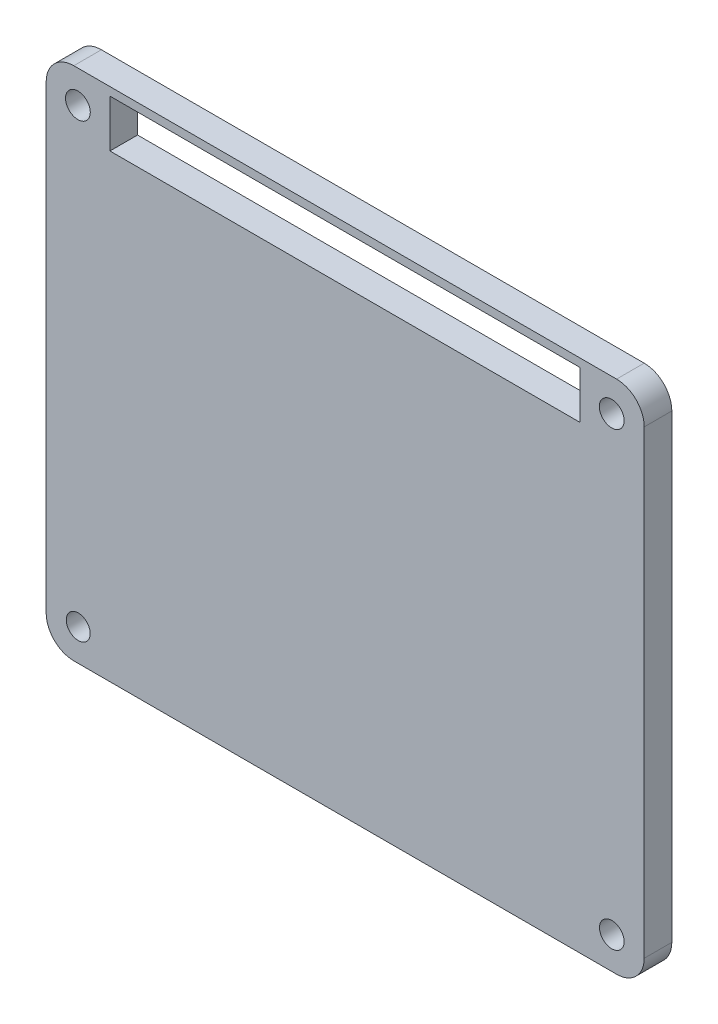
ISO-10303-21;
HEADER;
FILE_DESCRIPTION(('STEP AP214'),'2;1');
FILE_NAME('part.step','',(''),(''),'','','');
FILE_SCHEMA(('AUTOMOTIVE_DESIGN { 1 0 10303 214 1 1 1 1 }'));
ENDSEC;
DATA;
#1=APPLICATION_CONTEXT('core data for automotive mechanical design processes');
#2=APPLICATION_PROTOCOL_DEFINITION('international standard','automotive_design',2000,#1);
#3=PRODUCT_CONTEXT('',#1,'mechanical');
#4=PRODUCT('Part','Part','',(#3));
#5=PRODUCT_RELATED_PRODUCT_CATEGORY('part','',(#4));
#6=PRODUCT_DEFINITION_FORMATION('','',#4);
#7=PRODUCT_DEFINITION_CONTEXT('part definition',#1,'design');
#8=PRODUCT_DEFINITION('design','',#6,#7);
#9=PRODUCT_DEFINITION_SHAPE('','',#8);
#10=(LENGTH_UNIT() NAMED_UNIT(*) SI_UNIT(.MILLI.,.METRE.));
#11=(NAMED_UNIT(*) PLANE_ANGLE_UNIT() SI_UNIT($,.RADIAN.));
#12=(NAMED_UNIT(*) SI_UNIT($,.STERADIAN.) SOLID_ANGLE_UNIT());
#13=UNCERTAINTY_MEASURE_WITH_UNIT(LENGTH_MEASURE(1.E-05),#10,'distance_accuracy_value','');
#14=(GEOMETRIC_REPRESENTATION_CONTEXT(3) GLOBAL_UNCERTAINTY_ASSIGNED_CONTEXT((#13)) GLOBAL_UNIT_ASSIGNED_CONTEXT((#10,
#11,#12)) REPRESENTATION_CONTEXT('',''));
#15=CARTESIAN_POINT('',(0.,0.,0.));
#16=DIRECTION('',(0.,0.,1.));
#17=DIRECTION('',(1.,0.,0.));
#18=AXIS2_PLACEMENT_3D('',#15,#16,#17);
#19=CARTESIAN_POINT('',(201.871913251507,253.348131253436,3.));
#20=DIRECTION('',(0.,0.,-1.));
#21=DIRECTION('',(-1.,0.,0.));
#22=AXIS2_PLACEMENT_3D('',#19,#20,#21);
#23=PLANE('',#22);
#24=CARTESIAN_POINT('',(201.871913251507,253.348131253436,3.));
#25=DIRECTION('',(0.,0.,1.));
#26=DIRECTION('',(-1.,0.,0.));
#27=AXIS2_PLACEMENT_3D('',#24,#25,#26);
#28=CIRCLE('',#27,3.);
#29=CARTESIAN_POINT('',(201.871913251507,250.348131253436,3.));
#30=VERTEX_POINT('',#29);
#31=CARTESIAN_POINT('',(204.871913251507,253.348131253436,3.));
#32=VERTEX_POINT('',#31);
#33=EDGE_CURVE('E180',#30,#32,#28,.T.);
#34=ORIENTED_EDGE('',*,*,#33,.T.);
#35=DIRECTION('',(0.,1.,0.));
#36=VECTOR('',#35,1.);
#37=CARTESIAN_POINT('',(204.871913251507,303.333520822125,3.));
#38=LINE('',#37,#36);
#39=CARTESIAN_POINT('',(204.871913251507,303.333520822125,3.));
#40=VERTEX_POINT('',#39);
#41=EDGE_CURVE('E184',#32,#40,#38,.T.);
#42=ORIENTED_EDGE('',*,*,#41,.T.);
#43=CARTESIAN_POINT('',(201.871913251507,303.333520822125,3.));
#44=DIRECTION('',(0.,0.,1.));
#45=DIRECTION('',(-1.,0.,0.));
#46=AXIS2_PLACEMENT_3D('',#43,#44,#45);
#47=CIRCLE('',#46,3.);
#48=CARTESIAN_POINT('',(201.871913251507,306.333520822125,3.));
#49=VERTEX_POINT('',#48);
#50=EDGE_CURVE('E188',#40,#49,#47,.T.);
#51=ORIENTED_EDGE('',*,*,#50,.T.);
#52=DIRECTION('',(-1.,0.,0.));
#53=VECTOR('',#52,1.);
#54=CARTESIAN_POINT('',(142.914343154071,306.333520822125,3.));
#55=LINE('',#54,#53);
#56=CARTESIAN_POINT('',(142.914343154071,306.333520822125,3.));
#57=VERTEX_POINT('',#56);
#58=EDGE_CURVE('E191',#49,#57,#55,.T.);
#59=ORIENTED_EDGE('',*,*,#58,.T.);
#60=CARTESIAN_POINT('',(142.914343154071,303.333520822125,3.));
#61=DIRECTION('',(0.,0.,1.));
#62=DIRECTION('',(1.,0.,0.));
#63=AXIS2_PLACEMENT_3D('',#60,#61,#62);
#64=CIRCLE('',#63,3.);
#65=CARTESIAN_POINT('',(139.914343154071,303.333520822125,3.));
#66=VERTEX_POINT('',#65);
#67=EDGE_CURVE('E194',#57,#66,#64,.T.);
#68=ORIENTED_EDGE('',*,*,#67,.T.);
#69=DIRECTION('',(0.,-1.,0.));
#70=VECTOR('',#69,1.);
#71=CARTESIAN_POINT('',(139.914343154071,253.348131253436,3.));
#72=LINE('',#71,#70);
#73=CARTESIAN_POINT('',(139.914343154071,253.348131253436,3.));
#74=VERTEX_POINT('',#73);
#75=EDGE_CURVE('E197',#66,#74,#72,.T.);
#76=ORIENTED_EDGE('',*,*,#75,.T.);
#77=CARTESIAN_POINT('',(142.914343154071,253.348131253436,3.));
#78=DIRECTION('',(0.,0.,1.));
#79=DIRECTION('',(-1.,0.,0.));
#80=AXIS2_PLACEMENT_3D('',#77,#78,#79);
#81=CIRCLE('',#80,3.);
#82=CARTESIAN_POINT('',(142.914343154071,250.348131253436,3.));
#83=VERTEX_POINT('',#82);
#84=EDGE_CURVE('E200',#74,#83,#81,.T.);
#85=ORIENTED_EDGE('',*,*,#84,.T.);
#86=DIRECTION('',(1.,0.,0.));
#87=VECTOR('',#86,1.);
#88=CARTESIAN_POINT('',(201.871913251507,250.348131253436,3.));
#89=LINE('',#88,#87);
#90=EDGE_CURVE('E203',#83,#30,#89,.T.);
#91=ORIENTED_EDGE('',*,*,#90,.T.);
#92=EDGE_LOOP('',(#34,#42,#51,#59,#68,#76,#85,#91));
#93=FACE_BOUND('',#92,.T.);
#94=DIRECTION('',(0.,-1.,0.));
#95=VECTOR('',#94,1.);
#96=CARTESIAN_POINT('',(146.841273749476,305.438109267828,3.));
#97=LINE('',#96,#95);
#98=CARTESIAN_POINT('',(146.841273749476,305.438109267828,3.));
#99=VERTEX_POINT('',#98);
#100=CARTESIAN_POINT('',(146.841273749476,300.27526589932,3.));
#101=VERTEX_POINT('',#100);
#102=EDGE_CURVE('E129',#99,#101,#97,.T.);
#103=ORIENTED_EDGE('',*,*,#102,.F.);
#104=DIRECTION('',(-1.,0.,0.));
#105=VECTOR('',#104,1.);
#106=CARTESIAN_POINT('',(146.841273749476,305.438109267828,3.));
#107=LINE('',#106,#105);
#108=CARTESIAN_POINT('',(197.901828008849,305.438109267828,3.));
#109=VERTEX_POINT('',#108);
#110=EDGE_CURVE('E156',#109,#99,#107,.T.);
#111=ORIENTED_EDGE('',*,*,#110,.F.);
#112=DIRECTION('',(0.,1.,0.));
#113=VECTOR('',#112,1.);
#114=CARTESIAN_POINT('',(197.901828008849,305.438109267828,3.));
#115=LINE('',#114,#113);
#116=CARTESIAN_POINT('',(197.901828008849,300.27526589932,3.));
#117=VERTEX_POINT('',#116);
#118=EDGE_CURVE('E152',#117,#109,#115,.T.);
#119=ORIENTED_EDGE('',*,*,#118,.F.);
#120=DIRECTION('',(1.,0.,0.));
#121=VECTOR('',#120,1.);
#122=CARTESIAN_POINT('',(146.841273749476,300.27526589932,3.));
#123=LINE('',#122,#121);
#124=EDGE_CURVE('E138',#101,#117,#123,.T.);
#125=ORIENTED_EDGE('',*,*,#124,.F.);
#126=EDGE_LOOP('',(#103,#111,#119,#125));
#127=FACE_BOUND('',#126,.T.);
#128=CARTESIAN_POINT('',(143.360544481449,302.831604494432,3.));
#129=DIRECTION('',(0.,0.,1.));
#130=DIRECTION('',(1.,0.,0.));
#131=AXIS2_PLACEMENT_3D('',#128,#129,#130);
#132=CIRCLE('',#131,1.34534522063001);
#133=CARTESIAN_POINT('',(144.705889702079,302.831604494432,3.));
#134=VERTEX_POINT('',#133);
#135=EDGE_CURVE('E164',#134,#134,#132,.T.);
#136=ORIENTED_EDGE('',*,*,#135,.F.);
#137=EDGE_LOOP('',(#136));
#138=FACE_BOUND('',#137,.T.);
#139=CARTESIAN_POINT('',(201.344684378207,302.818633302361,3.));
#140=DIRECTION('',(0.,0.,1.));
#141=DIRECTION('',(1.,0.,0.));
#142=AXIS2_PLACEMENT_3D('',#139,#140,#141);
#143=CIRCLE('',#142,1.34690922053071);
#144=CARTESIAN_POINT('',(202.691593598737,302.818633302361,3.));
#145=VERTEX_POINT('',#144);
#146=EDGE_CURVE('E369',#145,#145,#143,.T.);
#147=ORIENTED_EDGE('',*,*,#146,.F.);
#148=EDGE_LOOP('',(#147));
#149=FACE_BOUND('',#148,.T.);
#150=CARTESIAN_POINT('',(143.395469298573,253.802031827382,3.));
#151=DIRECTION('',(0.,0.,1.));
#152=DIRECTION('',(1.,0.,0.));
#153=AXIS2_PLACEMENT_3D('',#150,#151,#152);
#154=CIRCLE('',#153,1.29861131616477);
#155=CARTESIAN_POINT('',(144.694080614738,253.802031827382,3.));
#156=VERTEX_POINT('',#155);
#157=EDGE_CURVE('E361',#156,#156,#154,.T.);
#158=ORIENTED_EDGE('',*,*,#157,.F.);
#159=EDGE_LOOP('',(#158));
#160=FACE_BOUND('',#159,.T.);
#161=CARTESIAN_POINT('',(201.354862045578,253.815125267861,3.));
#162=DIRECTION('',(0.,0.,1.));
#163=DIRECTION('',(1.,0.,0.));
#164=AXIS2_PLACEMENT_3D('',#161,#162,#163);
#165=CIRCLE('',#164,1.3356837614244);
#166=CARTESIAN_POINT('',(202.690545807002,253.815125267861,3.));
#167=VERTEX_POINT('',#166);
#168=EDGE_CURVE('E350',#167,#167,#165,.T.);
#169=ORIENTED_EDGE('',*,*,#168,.F.);
#170=EDGE_LOOP('',(#169));
#171=FACE_BOUND('',#170,.T.);
#172=ADVANCED_FACE('F39',(#93,#127,#138,#149,#160,#171),#23,.F.);
#173=CARTESIAN_POINT('',(201.871913251507,253.348131253436,0.));
#174=DIRECTION('',(0.,0.,-1.));
#175=DIRECTION('',(-1.,0.,0.));
#176=AXIS2_PLACEMENT_3D('',#173,#174,#175);
#177=PLANE('',#176);
#178=CARTESIAN_POINT('',(143.395469298573,253.802031827382,0.));
#179=DIRECTION('',(0.,0.,1.));
#180=DIRECTION('',(1.,0.,0.));
#181=AXIS2_PLACEMENT_3D('',#178,#179,#180);
#182=CIRCLE('',#181,1.29861131616477);
#183=CARTESIAN_POINT('',(144.694080614738,253.802031827382,0.));
#184=VERTEX_POINT('',#183);
#185=EDGE_CURVE('E358',#184,#184,#182,.T.);
#186=ORIENTED_EDGE('',*,*,#185,.T.);
#187=EDGE_LOOP('',(#186));
#188=FACE_BOUND('',#187,.T.);
#189=CARTESIAN_POINT('',(143.360544481449,302.831604494432,0.));
#190=DIRECTION('',(0.,0.,1.));
#191=DIRECTION('',(1.,0.,0.));
#192=AXIS2_PLACEMENT_3D('',#189,#190,#191);
#193=CIRCLE('',#192,1.34534522063001);
#194=CARTESIAN_POINT('',(144.705889702079,302.831604494432,0.));
#195=VERTEX_POINT('',#194);
#196=EDGE_CURVE('E373',#195,#195,#193,.T.);
#197=ORIENTED_EDGE('',*,*,#196,.T.);
#198=EDGE_LOOP('',(#197));
#199=FACE_BOUND('',#198,.T.);
#200=CARTESIAN_POINT('',(201.871913251507,253.348131253436,0.));
#201=DIRECTION('',(0.,0.,1.));
#202=DIRECTION('',(-1.,0.,0.));
#203=AXIS2_PLACEMENT_3D('',#200,#201,#202);
#204=CIRCLE('',#203,3.);
#205=CARTESIAN_POINT('',(201.871913251507,250.348131253436,0.));
#206=VERTEX_POINT('',#205);
#207=CARTESIAN_POINT('',(204.871913251507,253.348131253436,0.));
#208=VERTEX_POINT('',#207);
#209=EDGE_CURVE('E147',#206,#208,#204,.T.);
#210=ORIENTED_EDGE('',*,*,#209,.F.);
#211=DIRECTION('',(1.,0.,0.));
#212=VECTOR('',#211,1.);
#213=CARTESIAN_POINT('',(201.871913251507,250.348131253436,0.));
#214=LINE('',#213,#212);
#215=CARTESIAN_POINT('',(142.914343154071,250.348131253436,0.));
#216=VERTEX_POINT('',#215);
#217=EDGE_CURVE('E185',#216,#206,#214,.T.);
#218=ORIENTED_EDGE('',*,*,#217,.F.);
#219=CARTESIAN_POINT('',(142.914343154071,253.348131253436,0.));
#220=DIRECTION('',(0.,0.,1.));
#221=DIRECTION('',(-1.,0.,0.));
#222=AXIS2_PLACEMENT_3D('',#219,#220,#221);
#223=CIRCLE('',#222,3.);
#224=CARTESIAN_POINT('',(139.914343154071,253.348131253436,0.));
#225=VERTEX_POINT('',#224);
#226=EDGE_CURVE('E225',#225,#216,#223,.T.);
#227=ORIENTED_EDGE('',*,*,#226,.F.);
#228=DIRECTION('',(0.,-1.,0.));
#229=VECTOR('',#228,1.);
#230=CARTESIAN_POINT('',(139.914343154071,253.348131253436,0.));
#231=LINE('',#230,#229);
#232=CARTESIAN_POINT('',(139.914343154071,303.333520822125,0.));
#233=VERTEX_POINT('',#232);
#234=EDGE_CURVE('E222',#233,#225,#231,.T.);
#235=ORIENTED_EDGE('',*,*,#234,.F.);
#236=CARTESIAN_POINT('',(142.914343154071,303.333520822125,0.));
#237=DIRECTION('',(0.,0.,1.));
#238=DIRECTION('',(1.,0.,0.));
#239=AXIS2_PLACEMENT_3D('',#236,#237,#238);
#240=CIRCLE('',#239,3.);
#241=CARTESIAN_POINT('',(142.914343154071,306.333520822125,0.));
#242=VERTEX_POINT('',#241);
#243=EDGE_CURVE('E219',#242,#233,#240,.T.);
#244=ORIENTED_EDGE('',*,*,#243,.F.);
#245=DIRECTION('',(-1.,0.,0.));
#246=VECTOR('',#245,1.);
#247=CARTESIAN_POINT('',(142.914343154071,306.333520822125,0.));
#248=LINE('',#247,#246);
#249=CARTESIAN_POINT('',(201.871913251507,306.333520822125,0.));
#250=VERTEX_POINT('',#249);
#251=EDGE_CURVE('E216',#250,#242,#248,.T.);
#252=ORIENTED_EDGE('',*,*,#251,.F.);
#253=CARTESIAN_POINT('',(201.871913251507,303.333520822125,0.));
#254=DIRECTION('',(0.,0.,1.));
#255=DIRECTION('',(-1.,0.,0.));
#256=AXIS2_PLACEMENT_3D('',#253,#254,#255);
#257=CIRCLE('',#256,3.);
#258=CARTESIAN_POINT('',(204.871913251507,303.333520822125,0.));
#259=VERTEX_POINT('',#258);
#260=EDGE_CURVE('E213',#259,#250,#257,.T.);
#261=ORIENTED_EDGE('',*,*,#260,.F.);
#262=DIRECTION('',(0.,1.,0.));
#263=VECTOR('',#262,1.);
#264=CARTESIAN_POINT('',(204.871913251507,303.333520822125,0.));
#265=LINE('',#264,#263);
#266=EDGE_CURVE('E210',#208,#259,#265,.T.);
#267=ORIENTED_EDGE('',*,*,#266,.F.);
#268=EDGE_LOOP('',(#210,#218,#227,#235,#244,#252,#261,#267));
#269=FACE_BOUND('',#268,.T.);
#270=DIRECTION('',(-1.,0.,0.));
#271=VECTOR('',#270,1.);
#272=CARTESIAN_POINT('',(146.841273749476,305.438109267828,0.));
#273=LINE('',#272,#271);
#274=CARTESIAN_POINT('',(197.901828008849,305.438109267828,0.));
#275=VERTEX_POINT('',#274);
#276=CARTESIAN_POINT('',(146.841273749476,305.438109267828,0.));
#277=VERTEX_POINT('',#276);
#278=EDGE_CURVE('E139',#275,#277,#273,.T.);
#279=ORIENTED_EDGE('',*,*,#278,.T.);
#280=DIRECTION('',(0.,-1.,0.));
#281=VECTOR('',#280,1.);
#282=CARTESIAN_POINT('',(146.841273749476,305.438109267828,0.));
#283=LINE('',#282,#281);
#284=CARTESIAN_POINT('',(146.841273749476,300.27526589932,0.));
#285=VERTEX_POINT('',#284);
#286=EDGE_CURVE('E63',#277,#285,#283,.T.);
#287=ORIENTED_EDGE('',*,*,#286,.T.);
#288=DIRECTION('',(1.,0.,0.));
#289=VECTOR('',#288,1.);
#290=CARTESIAN_POINT('',(146.841273749476,300.27526589932,0.));
#291=LINE('',#290,#289);
#292=CARTESIAN_POINT('',(197.901828008849,300.27526589932,0.));
#293=VERTEX_POINT('',#292);
#294=EDGE_CURVE('E145',#285,#293,#291,.T.);
#295=ORIENTED_EDGE('',*,*,#294,.T.);
#296=DIRECTION('',(0.,1.,0.));
#297=VECTOR('',#296,1.);
#298=CARTESIAN_POINT('',(197.901828008849,305.438109267828,0.));
#299=LINE('',#298,#297);
#300=EDGE_CURVE('E167',#293,#275,#299,.T.);
#301=ORIENTED_EDGE('',*,*,#300,.T.);
#302=EDGE_LOOP('',(#279,#287,#295,#301));
#303=FACE_BOUND('',#302,.T.);
#304=CARTESIAN_POINT('',(201.344684378207,302.818633302361,0.));
#305=DIRECTION('',(0.,0.,1.));
#306=DIRECTION('',(1.,0.,0.));
#307=AXIS2_PLACEMENT_3D('',#304,#305,#306);
#308=CIRCLE('',#307,1.34690922053071);
#309=CARTESIAN_POINT('',(202.691593598737,302.818633302361,0.));
#310=VERTEX_POINT('',#309);
#311=EDGE_CURVE('E365',#310,#310,#308,.T.);
#312=ORIENTED_EDGE('',*,*,#311,.T.);
#313=EDGE_LOOP('',(#312));
#314=FACE_BOUND('',#313,.T.);
#315=CARTESIAN_POINT('',(201.354862045578,253.815125267861,0.));
#316=DIRECTION('',(0.,0.,1.));
#317=DIRECTION('',(1.,0.,0.));
#318=AXIS2_PLACEMENT_3D('',#315,#316,#317);
#319=CIRCLE('',#318,1.3356837614244);
#320=CARTESIAN_POINT('',(202.690545807002,253.815125267861,0.));
#321=VERTEX_POINT('',#320);
#322=EDGE_CURVE('E353',#321,#321,#319,.T.);
#323=ORIENTED_EDGE('',*,*,#322,.T.);
#324=EDGE_LOOP('',(#323));
#325=FACE_BOUND('',#324,.T.);
#326=ADVANCED_FACE('F264',(#188,#199,#269,#303,#314,#325),#177,.T.);
#327=CARTESIAN_POINT('',(201.871913251507,253.348131253436,3.));
#328=DIRECTION('',(0.,0.,-1.));
#329=DIRECTION('',(-1.,0.,0.));
#330=AXIS2_PLACEMENT_3D('',#327,#328,#329);
#331=CYLINDRICAL_SURFACE('',#330,3.);
#332=ORIENTED_EDGE('',*,*,#209,.T.);
#333=DIRECTION('',(0.,0.,-1.));
#334=VECTOR('',#333,1.);
#335=CARTESIAN_POINT('',(204.871913251507,253.348131253436,3.));
#336=LINE('',#335,#334);
#337=EDGE_CURVE('E11',#32,#208,#336,.T.);
#338=ORIENTED_EDGE('',*,*,#337,.F.);
#339=ORIENTED_EDGE('',*,*,#33,.F.);
#340=DIRECTION('',(0.,0.,-1.));
#341=VECTOR('',#340,1.);
#342=CARTESIAN_POINT('',(201.871913251507,250.348131253436,3.));
#343=LINE('',#342,#341);
#344=EDGE_CURVE('E206',#30,#206,#343,.T.);
#345=ORIENTED_EDGE('',*,*,#344,.T.);
#346=EDGE_LOOP('',(#332,#338,#339,#345));
#347=FACE_BOUND('',#346,.T.);
#348=ADVANCED_FACE('F41',(#347),#331,.T.);
#349=CARTESIAN_POINT('',(204.871913251507,303.333520822125,3.));
#350=DIRECTION('',(-1.,0.,0.));
#351=DIRECTION('',(0.,0.,1.));
#352=AXIS2_PLACEMENT_3D('',#349,#350,#351);
#353=PLANE('',#352);
#354=ORIENTED_EDGE('',*,*,#266,.T.);
#355=DIRECTION('',(0.,0.,-1.));
#356=VECTOR('',#355,1.);
#357=CARTESIAN_POINT('',(204.871913251507,303.333520822125,3.));
#358=LINE('',#357,#356);
#359=EDGE_CURVE('E48',#40,#259,#358,.T.);
#360=ORIENTED_EDGE('',*,*,#359,.F.);
#361=ORIENTED_EDGE('',*,*,#41,.F.);
#362=ORIENTED_EDGE('',*,*,#337,.T.);
#363=EDGE_LOOP('',(#354,#360,#361,#362));
#364=FACE_BOUND('',#363,.T.);
#365=ADVANCED_FACE('F281',(#364),#353,.F.);
#366=CARTESIAN_POINT('',(201.871913251507,303.333520822125,3.));
#367=DIRECTION('',(0.,0.,-1.));
#368=DIRECTION('',(-1.,0.,0.));
#369=AXIS2_PLACEMENT_3D('',#366,#367,#368);
#370=CYLINDRICAL_SURFACE('',#369,3.);
#371=ORIENTED_EDGE('',*,*,#260,.T.);
#372=DIRECTION('',(0.,0.,-1.));
#373=VECTOR('',#372,1.);
#374=CARTESIAN_POINT('',(201.871913251507,306.333520822125,3.));
#375=LINE('',#374,#373);
#376=EDGE_CURVE('E249',#49,#250,#375,.T.);
#377=ORIENTED_EDGE('',*,*,#376,.F.);
#378=ORIENTED_EDGE('',*,*,#50,.F.);
#379=ORIENTED_EDGE('',*,*,#359,.T.);
#380=EDGE_LOOP('',(#371,#377,#378,#379));
#381=FACE_BOUND('',#380,.T.);
#382=ADVANCED_FACE('F258',(#381),#370,.T.);
#383=CARTESIAN_POINT('',(142.914343154071,306.333520822125,3.));
#384=DIRECTION('',(0.,-1.,0.));
#385=DIRECTION('',(0.,0.,-1.));
#386=AXIS2_PLACEMENT_3D('',#383,#384,#385);
#387=PLANE('',#386);
#388=ORIENTED_EDGE('',*,*,#251,.T.);
#389=DIRECTION('',(0.,0.,-1.));
#390=VECTOR('',#389,1.);
#391=CARTESIAN_POINT('',(142.914343154071,306.333520822125,3.));
#392=LINE('',#391,#390);
#393=EDGE_CURVE('E245',#57,#242,#392,.T.);
#394=ORIENTED_EDGE('',*,*,#393,.F.);
#395=ORIENTED_EDGE('',*,*,#58,.F.);
#396=ORIENTED_EDGE('',*,*,#376,.T.);
#397=EDGE_LOOP('',(#388,#394,#395,#396));
#398=FACE_BOUND('',#397,.T.);
#399=ADVANCED_FACE('F270',(#398),#387,.F.);
#400=CARTESIAN_POINT('',(142.914343154071,303.333520822125,3.));
#401=DIRECTION('',(0.,0.,-1.));
#402=DIRECTION('',(-1.,0.,0.));
#403=AXIS2_PLACEMENT_3D('',#400,#401,#402);
#404=CYLINDRICAL_SURFACE('',#403,3.);
#405=ORIENTED_EDGE('',*,*,#243,.T.);
#406=DIRECTION('',(0.,0.,-1.));
#407=VECTOR('',#406,1.);
#408=CARTESIAN_POINT('',(139.914343154071,303.333520822125,3.));
#409=LINE('',#408,#407);
#410=EDGE_CURVE('E241',#66,#233,#409,.T.);
#411=ORIENTED_EDGE('',*,*,#410,.F.);
#412=ORIENTED_EDGE('',*,*,#67,.F.);
#413=ORIENTED_EDGE('',*,*,#393,.T.);
#414=EDGE_LOOP('',(#405,#411,#412,#413));
#415=FACE_BOUND('',#414,.T.);
#416=ADVANCED_FACE('F274',(#415),#404,.T.);
#417=CARTESIAN_POINT('',(139.914343154071,253.348131253436,3.));
#418=DIRECTION('',(1.,0.,0.));
#419=DIRECTION('',(0.,0.,-1.));
#420=AXIS2_PLACEMENT_3D('',#417,#418,#419);
#421=PLANE('',#420);
#422=ORIENTED_EDGE('',*,*,#234,.T.);
#423=DIRECTION('',(0.,0.,-1.));
#424=VECTOR('',#423,1.);
#425=CARTESIAN_POINT('',(139.914343154071,253.348131253436,3.));
#426=LINE('',#425,#424);
#427=EDGE_CURVE('E237',#74,#225,#426,.T.);
#428=ORIENTED_EDGE('',*,*,#427,.F.);
#429=ORIENTED_EDGE('',*,*,#75,.F.);
#430=ORIENTED_EDGE('',*,*,#410,.T.);
#431=EDGE_LOOP('',(#422,#428,#429,#430));
#432=FACE_BOUND('',#431,.T.);
#433=ADVANCED_FACE('F294',(#432),#421,.F.);
#434=CARTESIAN_POINT('',(142.914343154071,253.348131253436,3.));
#435=DIRECTION('',(0.,0.,-1.));
#436=DIRECTION('',(-1.,0.,0.));
#437=AXIS2_PLACEMENT_3D('',#434,#435,#436);
#438=CYLINDRICAL_SURFACE('',#437,3.);
#439=ORIENTED_EDGE('',*,*,#226,.T.);
#440=DIRECTION('',(0.,0.,-1.));
#441=VECTOR('',#440,1.);
#442=CARTESIAN_POINT('',(142.914343154071,250.348131253436,3.));
#443=LINE('',#442,#441);
#444=EDGE_CURVE('E233',#83,#216,#443,.T.);
#445=ORIENTED_EDGE('',*,*,#444,.F.);
#446=ORIENTED_EDGE('',*,*,#84,.F.);
#447=ORIENTED_EDGE('',*,*,#427,.T.);
#448=EDGE_LOOP('',(#439,#445,#446,#447));
#449=FACE_BOUND('',#448,.T.);
#450=ADVANCED_FACE('F292',(#449),#438,.T.);
#451=CARTESIAN_POINT('',(201.871913251507,250.348131253436,3.));
#452=DIRECTION('',(0.,1.,0.));
#453=DIRECTION('',(0.,0.,1.));
#454=AXIS2_PLACEMENT_3D('',#451,#452,#453);
#455=PLANE('',#454);
#456=ORIENTED_EDGE('',*,*,#217,.T.);
#457=ORIENTED_EDGE('',*,*,#344,.F.);
#458=ORIENTED_EDGE('',*,*,#90,.F.);
#459=ORIENTED_EDGE('',*,*,#444,.T.);
#460=EDGE_LOOP('',(#456,#457,#458,#459));
#461=FACE_BOUND('',#460,.T.);
#462=ADVANCED_FACE('F287',(#461),#455,.F.);
#463=CARTESIAN_POINT('',(146.841273749476,305.438109267828,3.));
#464=DIRECTION('',(1.,0.,0.));
#465=DIRECTION('',(0.,0.,-1.));
#466=AXIS2_PLACEMENT_3D('',#463,#464,#465);
#467=PLANE('',#466);
#468=ORIENTED_EDGE('',*,*,#286,.F.);
#469=DIRECTION('',(0.,0.,-1.));
#470=VECTOR('',#469,1.);
#471=CARTESIAN_POINT('',(146.841273749476,305.438109267828,3.));
#472=LINE('',#471,#470);
#473=EDGE_CURVE('E133',#99,#277,#472,.T.);
#474=ORIENTED_EDGE('',*,*,#473,.F.);
#475=ORIENTED_EDGE('',*,*,#102,.T.);
#476=DIRECTION('',(0.,0.,-1.));
#477=VECTOR('',#476,1.);
#478=CARTESIAN_POINT('',(146.841273749476,300.27526589932,3.));
#479=LINE('',#478,#477);
#480=EDGE_CURVE('E132',#101,#285,#479,.T.);
#481=ORIENTED_EDGE('',*,*,#480,.T.);
#482=EDGE_LOOP('',(#468,#474,#475,#481));
#483=FACE_BOUND('',#482,.T.);
#484=ADVANCED_FACE('F131',(#483),#467,.T.);
#485=CARTESIAN_POINT('',(146.841273749476,300.27526589932,3.));
#486=DIRECTION('',(0.,1.,0.));
#487=DIRECTION('',(0.,0.,1.));
#488=AXIS2_PLACEMENT_3D('',#485,#486,#487);
#489=PLANE('',#488);
#490=ORIENTED_EDGE('',*,*,#294,.F.);
#491=ORIENTED_EDGE('',*,*,#480,.F.);
#492=ORIENTED_EDGE('',*,*,#124,.T.);
#493=DIRECTION('',(0.,0.,-1.));
#494=VECTOR('',#493,1.);
#495=CARTESIAN_POINT('',(197.901828008849,300.27526589932,3.));
#496=LINE('',#495,#494);
#497=EDGE_CURVE('E148',#117,#293,#496,.T.);
#498=ORIENTED_EDGE('',*,*,#497,.T.);
#499=EDGE_LOOP('',(#490,#491,#492,#498));
#500=FACE_BOUND('',#499,.T.);
#501=ADVANCED_FACE('F142',(#500),#489,.T.);
#502=CARTESIAN_POINT('',(197.901828008849,305.438109267828,3.));
#503=DIRECTION('',(-1.,0.,0.));
#504=DIRECTION('',(0.,0.,1.));
#505=AXIS2_PLACEMENT_3D('',#502,#503,#504);
#506=PLANE('',#505);
#507=ORIENTED_EDGE('',*,*,#300,.F.);
#508=ORIENTED_EDGE('',*,*,#497,.F.);
#509=ORIENTED_EDGE('',*,*,#118,.T.);
#510=DIRECTION('',(0.,0.,-1.));
#511=VECTOR('',#510,1.);
#512=CARTESIAN_POINT('',(197.901828008849,305.438109267828,3.));
#513=LINE('',#512,#511);
#514=EDGE_CURVE('E55',#109,#275,#513,.T.);
#515=ORIENTED_EDGE('',*,*,#514,.T.);
#516=EDGE_LOOP('',(#507,#508,#509,#515));
#517=FACE_BOUND('',#516,.T.);
#518=ADVANCED_FACE('F320',(#517),#506,.T.);
#519=CARTESIAN_POINT('',(146.841273749476,305.438109267828,3.));
#520=DIRECTION('',(0.,-1.,0.));
#521=DIRECTION('',(0.,0.,-1.));
#522=AXIS2_PLACEMENT_3D('',#519,#520,#521);
#523=PLANE('',#522);
#524=ORIENTED_EDGE('',*,*,#278,.F.);
#525=ORIENTED_EDGE('',*,*,#514,.F.);
#526=ORIENTED_EDGE('',*,*,#110,.T.);
#527=ORIENTED_EDGE('',*,*,#473,.T.);
#528=EDGE_LOOP('',(#524,#525,#526,#527));
#529=FACE_BOUND('',#528,.T.);
#530=ADVANCED_FACE('F324',(#529),#523,.T.);
#531=CARTESIAN_POINT('',(143.360544481449,302.831604494432,3.));
#532=DIRECTION('',(0.,0.,-1.));
#533=DIRECTION('',(-1.,0.,0.));
#534=AXIS2_PLACEMENT_3D('',#531,#532,#533);
#535=CYLINDRICAL_SURFACE('',#534,1.34534522063001);
#536=ORIENTED_EDGE('',*,*,#135,.T.);
#537=EDGE_LOOP('',(#536));
#538=FACE_BOUND('',#537,.T.);
#539=ORIENTED_EDGE('',*,*,#196,.F.);
#540=EDGE_LOOP('',(#539));
#541=FACE_BOUND('',#540,.T.);
#542=ADVANCED_FACE('F330',(#538,#541),#535,.F.);
#543=CARTESIAN_POINT('',(201.344684378207,302.818633302361,3.));
#544=DIRECTION('',(0.,0.,-1.));
#545=DIRECTION('',(-1.,0.,0.));
#546=AXIS2_PLACEMENT_3D('',#543,#544,#545);
#547=CYLINDRICAL_SURFACE('',#546,1.34690922053071);
#548=ORIENTED_EDGE('',*,*,#146,.T.);
#549=EDGE_LOOP('',(#548));
#550=FACE_BOUND('',#549,.T.);
#551=ORIENTED_EDGE('',*,*,#311,.F.);
#552=EDGE_LOOP('',(#551));
#553=FACE_BOUND('',#552,.T.);
#554=ADVANCED_FACE('F333',(#550,#553),#547,.F.);
#555=CARTESIAN_POINT('',(143.395469298573,253.802031827382,3.));
#556=DIRECTION('',(0.,0.,-1.));
#557=DIRECTION('',(-1.,0.,0.));
#558=AXIS2_PLACEMENT_3D('',#555,#556,#557);
#559=CYLINDRICAL_SURFACE('',#558,1.29861131616477);
#560=ORIENTED_EDGE('',*,*,#157,.T.);
#561=EDGE_LOOP('',(#560));
#562=FACE_BOUND('',#561,.T.);
#563=ORIENTED_EDGE('',*,*,#185,.F.);
#564=EDGE_LOOP('',(#563));
#565=FACE_BOUND('',#564,.T.);
#566=ADVANCED_FACE('F337',(#562,#565),#559,.F.);
#567=CARTESIAN_POINT('',(201.354862045578,253.815125267861,3.));
#568=DIRECTION('',(0.,0.,-1.));
#569=DIRECTION('',(-1.,0.,0.));
#570=AXIS2_PLACEMENT_3D('',#567,#568,#569);
#571=CYLINDRICAL_SURFACE('',#570,1.3356837614244);
#572=ORIENTED_EDGE('',*,*,#168,.T.);
#573=EDGE_LOOP('',(#572));
#574=FACE_BOUND('',#573,.T.);
#575=ORIENTED_EDGE('',*,*,#322,.F.);
#576=EDGE_LOOP('',(#575));
#577=FACE_BOUND('',#576,.T.);
#578=ADVANCED_FACE('F341',(#574,#577),#571,.F.);
#579=CLOSED_SHELL('',(#172,#326,#348,#365,#382,#399,#416,#433,#450,#462,#484,#501,#518,#530,
#542,#554,#566,#578));
#580=MANIFOLD_SOLID_BREP('B2',#579);
#581=ADVANCED_BREP_SHAPE_REPRESENTATION('',(#18,#580),#14);
#582=SHAPE_DEFINITION_REPRESENTATION(#9,#581);
ENDSEC;
END-ISO-10303-21;
